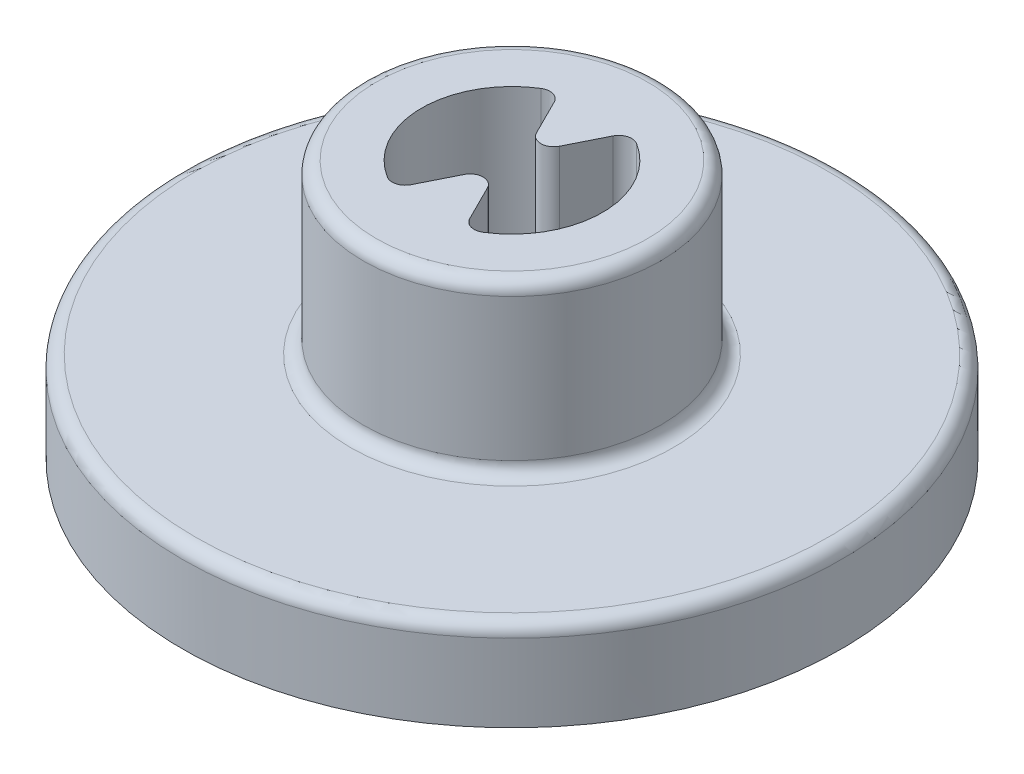
ISO-10303-21;
HEADER;
FILE_DESCRIPTION(('STEP AP214'),'2;1');
FILE_NAME('part.step','',(''),(''),'','','');
FILE_SCHEMA(('AUTOMOTIVE_DESIGN { 1 0 10303 214 1 1 1 1 }'));
ENDSEC;
DATA;
#1=APPLICATION_CONTEXT('core data for automotive mechanical design processes');
#2=APPLICATION_PROTOCOL_DEFINITION('international standard','automotive_design',2000,#1);
#3=PRODUCT_CONTEXT('',#1,'mechanical');
#4=PRODUCT('Part','Part','',(#3));
#5=PRODUCT_RELATED_PRODUCT_CATEGORY('part','',(#4));
#6=PRODUCT_DEFINITION_FORMATION('','',#4);
#7=PRODUCT_DEFINITION_CONTEXT('part definition',#1,'design');
#8=PRODUCT_DEFINITION('design','',#6,#7);
#9=PRODUCT_DEFINITION_SHAPE('','',#8);
#10=(LENGTH_UNIT() NAMED_UNIT(*) SI_UNIT(.MILLI.,.METRE.));
#11=(NAMED_UNIT(*) PLANE_ANGLE_UNIT() SI_UNIT($,.RADIAN.));
#12=(NAMED_UNIT(*) SI_UNIT($,.STERADIAN.) SOLID_ANGLE_UNIT());
#13=UNCERTAINTY_MEASURE_WITH_UNIT(LENGTH_MEASURE(1.E-05),#10,'distance_accuracy_value','');
#14=(GEOMETRIC_REPRESENTATION_CONTEXT(3) GLOBAL_UNCERTAINTY_ASSIGNED_CONTEXT((#13)) GLOBAL_UNIT_ASSIGNED_CONTEXT((#10,
#11,#12)) REPRESENTATION_CONTEXT('',''));
#15=CARTESIAN_POINT('',(0.,0.,0.));
#16=DIRECTION('',(0.,0.,1.));
#17=DIRECTION('',(1.,0.,0.));
#18=AXIS2_PLACEMENT_3D('',#15,#16,#17);
#19=CARTESIAN_POINT('',(0.,3.5,0.));
#20=DIRECTION('',(0.,-1.,0.));
#21=DIRECTION('',(0.,0.,-1.));
#22=AXIS2_PLACEMENT_3D('',#19,#20,#21);
#23=CYLINDRICAL_SURFACE('',#22,12.75);
#24=CARTESIAN_POINT('',(0.,3.,0.));
#25=DIRECTION('',(0.,1.,0.));
#26=DIRECTION('',(0.,0.,1.));
#27=AXIS2_PLACEMENT_3D('',#24,#25,#26);
#28=CIRCLE('',#27,12.75);
#29=CARTESIAN_POINT('',(0.,3.,-12.75));
#30=VERTEX_POINT('',#29);
#31=EDGE_CURVE('E234',#30,#30,#28,.F.);
#32=CARTESIAN_POINT('',(0.,0.,0.));
#33=DIRECTION('',(0.,1.,0.));
#34=DIRECTION('',(0.,0.,1.));
#35=AXIS2_PLACEMENT_3D('',#32,#33,#34);
#36=CIRCLE('',#35,12.75);
#37=CARTESIAN_POINT('',(0.,0.,-12.75));
#38=VERTEX_POINT('',#37);
#39=EDGE_CURVE('E206',#38,#38,#36,.T.);
#40=CARTESIAN_POINT('',(0.,3.,-12.75));
#41=CARTESIAN_POINT('',(0.,2.96875,-12.75));
#42=CARTESIAN_POINT('',(0.,2.9375,-12.75));
#43=CARTESIAN_POINT('',(0.,2.875,-12.75));
#44=CARTESIAN_POINT('',(0.,2.84375,-12.75));
#45=CARTESIAN_POINT('',(0.,2.78125,-12.75));
#46=CARTESIAN_POINT('',(0.,2.75,-12.75));
#47=CARTESIAN_POINT('',(0.,2.6875,-12.75));
#48=CARTESIAN_POINT('',(0.,2.65625,-12.75));
#49=CARTESIAN_POINT('',(0.,2.59375,-12.75));
#50=CARTESIAN_POINT('',(0.,2.5625,-12.75));
#51=CARTESIAN_POINT('',(0.,2.5,-12.75));
#52=CARTESIAN_POINT('',(0.,2.46875,-12.75));
#53=CARTESIAN_POINT('',(0.,2.40625,-12.75));
#54=CARTESIAN_POINT('',(0.,2.375,-12.75));
#55=CARTESIAN_POINT('',(0.,2.3125,-12.75));
#56=CARTESIAN_POINT('',(0.,2.28125,-12.75));
#57=CARTESIAN_POINT('',(0.,2.21875,-12.75));
#58=CARTESIAN_POINT('',(0.,2.1875,-12.75));
#59=CARTESIAN_POINT('',(0.,2.125,-12.75));
#60=CARTESIAN_POINT('',(0.,2.09375,-12.75));
#61=CARTESIAN_POINT('',(0.,2.03125,-12.75));
#62=CARTESIAN_POINT('',(0.,2.,-12.75));
#63=CARTESIAN_POINT('',(0.,1.9375,-12.75));
#64=CARTESIAN_POINT('',(0.,1.90625,-12.75));
#65=CARTESIAN_POINT('',(0.,1.84375,-12.75));
#66=CARTESIAN_POINT('',(0.,1.8125,-12.75));
#67=CARTESIAN_POINT('',(0.,1.75,-12.75));
#68=CARTESIAN_POINT('',(0.,1.71875,-12.75));
#69=CARTESIAN_POINT('',(0.,1.65625,-12.75));
#70=CARTESIAN_POINT('',(0.,1.625,-12.75));
#71=CARTESIAN_POINT('',(0.,1.5625,-12.75));
#72=CARTESIAN_POINT('',(0.,1.53125,-12.75));
#73=CARTESIAN_POINT('',(0.,1.46875,-12.75));
#74=CARTESIAN_POINT('',(0.,1.4375,-12.75));
#75=CARTESIAN_POINT('',(0.,1.375,-12.75));
#76=CARTESIAN_POINT('',(0.,1.34375,-12.75));
#77=CARTESIAN_POINT('',(0.,1.28125,-12.75));
#78=CARTESIAN_POINT('',(0.,1.25,-12.75));
#79=CARTESIAN_POINT('',(0.,1.1875,-12.75));
#80=CARTESIAN_POINT('',(0.,1.15625,-12.75));
#81=CARTESIAN_POINT('',(0.,1.09375,-12.75));
#82=CARTESIAN_POINT('',(0.,1.0625,-12.75));
#83=CARTESIAN_POINT('',(0.,1.,-12.75));
#84=CARTESIAN_POINT('',(0.,0.96875,-12.75));
#85=CARTESIAN_POINT('',(0.,0.90625,-12.75));
#86=CARTESIAN_POINT('',(0.,0.874999999999999,-12.75));
#87=CARTESIAN_POINT('',(0.,0.812499999999999,-12.75));
#88=CARTESIAN_POINT('',(0.,0.781249999999999,-12.75));
#89=CARTESIAN_POINT('',(0.,0.71875,-12.75));
#90=CARTESIAN_POINT('',(0.,0.6875,-12.75));
#91=CARTESIAN_POINT('',(0.,0.625,-12.75));
#92=CARTESIAN_POINT('',(0.,0.59375,-12.75));
#93=CARTESIAN_POINT('',(0.,0.53125,-12.75));
#94=CARTESIAN_POINT('',(0.,0.5,-12.75));
#95=CARTESIAN_POINT('',(0.,0.4375,-12.75));
#96=CARTESIAN_POINT('',(0.,0.40625,-12.75));
#97=CARTESIAN_POINT('',(0.,0.34375,-12.75));
#98=CARTESIAN_POINT('',(0.,0.3125,-12.75));
#99=CARTESIAN_POINT('',(0.,0.25,-12.75));
#100=CARTESIAN_POINT('',(0.,0.21875,-12.75));
#101=CARTESIAN_POINT('',(0.,0.15625,-12.75));
#102=CARTESIAN_POINT('',(0.,0.125,-12.75));
#103=CARTESIAN_POINT('',(0.,0.0624999999999996,-12.75));
#104=CARTESIAN_POINT('',(0.,0.0312499999999996,-12.75));
#105=CARTESIAN_POINT('',(0.,0.,-12.75));
#106=B_SPLINE_CURVE_WITH_KNOTS('',3,(#40,#41,#42,#43,#44,#45,#46,#47,#48,#49,#50,#51,#52,#53,
#54,#55,#56,#57,#58,#59,#60,#61,#62,#63,#64,#65,#66,#67,#68,#69,#70,#71,#72,#73,#74,#75,#76,#77,
#78,#79,#80,#81,#82,#83,#84,#85,#86,#87,#88,#89,#90,#91,#92,#93,#94,#95,#96,#97,#98,#99,#100,
#101,#102,#103,#104,#105),.UNSPECIFIED.,.F.,.F.,(4,2,2,2,2,2,2,2,2,2,2,2,2,2,2,2,2,2,2,2,2,2,2,
2,2,2,2,2,2,2,2,2,4),(0.,0.0937500000000001,0.1875,0.28125,0.375,0.46875,0.5625,0.65625,0.75,
0.84375,0.9375,1.03125,1.125,1.21875,1.3125,1.40625,1.5,1.59375,1.6875,1.78125,1.875,1.96875,
2.0625,2.15625,2.25,2.34375,2.4375,2.53125,2.625,2.71875,2.8125,2.90625,3.),.UNSPECIFIED.);
#107=EDGE_CURVE('BSEAM36',#30,#38,#106,.T.);
#108=ORIENTED_EDGE('',*,*,#31,.T.);
#109=ORIENTED_EDGE('',*,*,#39,.T.);
#110=ORIENTED_EDGE('',*,*,#107,.T.);
#111=ORIENTED_EDGE('',*,*,#107,.F.);
#112=EDGE_LOOP('',(#108,#110,#109,#111));
#113=FACE_BOUND('',#112,.T.);
#114=ADVANCED_FACE('F36',(#113),#23,.T.);
#115=CARTESIAN_POINT('',(0.,3.5,0.));
#116=DIRECTION('',(0.,1.,0.));
#117=DIRECTION('',(0.,0.,1.));
#118=AXIS2_PLACEMENT_3D('',#115,#116,#117);
#119=PLANE('',#118);
#120=CARTESIAN_POINT('',(0.,3.5,0.));
#121=DIRECTION('',(0.,1.,0.));
#122=DIRECTION('',(0.,0.,1.));
#123=AXIS2_PLACEMENT_3D('',#120,#121,#122);
#124=CIRCLE('',#123,12.25);
#125=CARTESIAN_POINT('',(0.,3.5,12.25));
#126=VERTEX_POINT('',#125);
#127=EDGE_CURVE('E231',#126,#126,#124,.T.);
#128=ORIENTED_EDGE('',*,*,#127,.T.);
#129=EDGE_LOOP('',(#128));
#130=FACE_BOUND('',#129,.T.);
#131=CARTESIAN_POINT('',(0.,3.5,0.));
#132=DIRECTION('',(0.,1.,0.));
#133=DIRECTION('',(0.,0.,1.));
#134=AXIS2_PLACEMENT_3D('',#131,#132,#133);
#135=CIRCLE('',#134,6.25);
#136=CARTESIAN_POINT('',(0.,3.5,6.25));
#137=VERTEX_POINT('',#136);
#138=EDGE_CURVE('E228',#137,#137,#135,.F.);
#139=ORIENTED_EDGE('',*,*,#138,.T.);
#140=EDGE_LOOP('',(#139));
#141=FACE_BOUND('',#140,.T.);
#142=ADVANCED_FACE('F255',(#130,#141),#119,.T.);
#143=CARTESIAN_POINT('',(0.,0.,0.));
#144=DIRECTION('',(0.,1.,0.));
#145=DIRECTION('',(0.,0.,1.));
#146=AXIS2_PLACEMENT_3D('',#143,#144,#145);
#147=PLANE('',#146);
#148=DIRECTION('',(-0.447213595499958,0.,0.894427190999916));
#149=VECTOR('',#148,1.);
#150=CARTESIAN_POINT('',(0.447213595499962,0.,-1.39442719099992));
#151=LINE('',#150,#149);
#152=CARTESIAN_POINT('',(1.13593463895132,0.,-2.77186927790264));
#153=VERTEX_POINT('',#152);
#154=CARTESIAN_POINT('',(0.447213595499962,0.,-1.39442719099992));
#155=VERTEX_POINT('',#154);
#156=EDGE_CURVE('E133',#153,#155,#151,.T.);
#157=ORIENTED_EDGE('',*,*,#156,.T.);
#158=CARTESIAN_POINT('',(0.,0.,-1.61803398874989));
#159=DIRECTION('',(0.,-1.,0.));
#160=DIRECTION('',(0.,0.,-1.));
#161=AXIS2_PLACEMENT_3D('',#158,#159,#160);
#162=CIRCLE('',#161,0.5);
#163=CARTESIAN_POINT('',(-0.447213595499962,0.,-1.39442719099992));
#164=VERTEX_POINT('',#163);
#165=EDGE_CURVE('E127',#155,#164,#162,.T.);
#166=ORIENTED_EDGE('',*,*,#165,.T.);
#167=DIRECTION('',(-0.447213595499958,0.,-0.894427190999916));
#168=VECTOR('',#167,1.);
#169=CARTESIAN_POINT('',(-0.447213595499962,0.,-1.39442719099992));
#170=LINE('',#169,#168);
#171=CARTESIAN_POINT('',(-1.13593463895132,0.,-2.77186927790264));
#172=VERTEX_POINT('',#171);
#173=EDGE_CURVE('E136',#164,#172,#170,.T.);
#174=ORIENTED_EDGE('',*,*,#173,.T.);
#175=CARTESIAN_POINT('',(-1.58314823445128,0.,-2.54826248015266));
#176=DIRECTION('',(0.,1.,0.));
#177=DIRECTION('',(0.,0.,1.));
#178=AXIS2_PLACEMENT_3D('',#175,#176,#177);
#179=CIRCLE('',#178,0.5);
#180=CARTESIAN_POINT('',(-1.84700627352649,0.,-2.97297289351144));
#181=VERTEX_POINT('',#180);
#182=EDGE_CURVE('E51',#172,#181,#179,.T.);
#183=ORIENTED_EDGE('',*,*,#182,.T.);
#184=CARTESIAN_POINT('',(0.,0.,0.));
#185=DIRECTION('',(0.,1.,0.));
#186=DIRECTION('',(0.,0.,1.));
#187=AXIS2_PLACEMENT_3D('',#184,#185,#186);
#188=CIRCLE('',#187,3.5);
#189=CARTESIAN_POINT('',(-1.84700627352649,0.,2.97297289351144));
#190=VERTEX_POINT('',#189);
#191=EDGE_CURVE('E151',#181,#190,#188,.T.);
#192=ORIENTED_EDGE('',*,*,#191,.T.);
#193=CARTESIAN_POINT('',(-1.58314823445128,0.,2.54826248015266));
#194=DIRECTION('',(0.,1.,0.));
#195=DIRECTION('',(0.,0.,-1.));
#196=AXIS2_PLACEMENT_3D('',#193,#194,#195);
#197=CIRCLE('',#196,0.5);
#198=CARTESIAN_POINT('',(-1.13593463895132,0.,2.77186927790264));
#199=VERTEX_POINT('',#198);
#200=EDGE_CURVE('E154',#190,#199,#197,.T.);
#201=ORIENTED_EDGE('',*,*,#200,.T.);
#202=DIRECTION('',(0.447213595499958,0.,-0.894427190999916));
#203=VECTOR('',#202,1.);
#204=CARTESIAN_POINT('',(-0.447213595499962,0.,1.39442719099992));
#205=LINE('',#204,#203);
#206=CARTESIAN_POINT('',(-0.447213595499961,0.,1.39442719099992));
#207=VERTEX_POINT('',#206);
#208=EDGE_CURVE('E157',#199,#207,#205,.T.);
#209=ORIENTED_EDGE('',*,*,#208,.T.);
#210=CARTESIAN_POINT('',(0.,0.,1.61803398874989));
#211=DIRECTION('',(0.,-1.,0.));
#212=DIRECTION('',(0.,0.,1.));
#213=AXIS2_PLACEMENT_3D('',#210,#211,#212);
#214=CIRCLE('',#213,0.5);
#215=CARTESIAN_POINT('',(0.447213595499962,0.,1.39442719099992));
#216=VERTEX_POINT('',#215);
#217=EDGE_CURVE('E160',#207,#216,#214,.T.);
#218=ORIENTED_EDGE('',*,*,#217,.T.);
#219=DIRECTION('',(0.447213595499958,0.,0.894427190999916));
#220=VECTOR('',#219,1.);
#221=CARTESIAN_POINT('',(0.447213595499962,0.,1.39442719099992));
#222=LINE('',#221,#220);
#223=CARTESIAN_POINT('',(1.13593463895132,0.,2.77186927790264));
#224=VERTEX_POINT('',#223);
#225=EDGE_CURVE('E163',#216,#224,#222,.T.);
#226=ORIENTED_EDGE('',*,*,#225,.T.);
#227=CARTESIAN_POINT('',(1.58314823445128,0.,2.54826248015266));
#228=DIRECTION('',(0.,1.,0.));
#229=DIRECTION('',(0.,0.,-1.));
#230=AXIS2_PLACEMENT_3D('',#227,#228,#229);
#231=CIRCLE('',#230,0.499999999999999);
#232=CARTESIAN_POINT('',(1.84700627352649,0.,2.97297289351144));
#233=VERTEX_POINT('',#232);
#234=EDGE_CURVE('E166',#224,#233,#231,.T.);
#235=ORIENTED_EDGE('',*,*,#234,.T.);
#236=CARTESIAN_POINT('',(0.,0.,0.));
#237=DIRECTION('',(0.,1.,0.));
#238=DIRECTION('',(0.,0.,1.));
#239=AXIS2_PLACEMENT_3D('',#236,#237,#238);
#240=CIRCLE('',#239,3.5);
#241=CARTESIAN_POINT('',(1.84700627352649,0.,-2.97297289351144));
#242=VERTEX_POINT('',#241);
#243=EDGE_CURVE('E169',#233,#242,#240,.T.);
#244=ORIENTED_EDGE('',*,*,#243,.T.);
#245=CARTESIAN_POINT('',(1.58314823445128,0.,-2.54826248015266));
#246=DIRECTION('',(0.,1.,0.));
#247=DIRECTION('',(0.,0.,1.));
#248=AXIS2_PLACEMENT_3D('',#245,#246,#247);
#249=CIRCLE('',#248,0.499999999999999);
#250=EDGE_CURVE('E172',#242,#153,#249,.T.);
#251=ORIENTED_EDGE('',*,*,#250,.T.);
#252=EDGE_LOOP('',(#157,#166,#174,#183,#192,#201,#209,#218,#226,#235,#244,#251));
#253=FACE_BOUND('',#252,.T.);
#254=ORIENTED_EDGE('',*,*,#39,.F.);
#255=EDGE_LOOP('',(#254));
#256=FACE_BOUND('',#255,.T.);
#257=ADVANCED_FACE('F140',(#253,#256),#147,.F.);
#258=CARTESIAN_POINT('',(0.,10.,0.));
#259=DIRECTION('',(0.,-1.,0.));
#260=DIRECTION('',(0.,0.,-1.));
#261=AXIS2_PLACEMENT_3D('',#258,#259,#260);
#262=CYLINDRICAL_SURFACE('',#261,5.75);
#263=CARTESIAN_POINT('',(0.,9.5,0.));
#264=DIRECTION('',(0.,1.,0.));
#265=DIRECTION('',(0.,0.,1.));
#266=AXIS2_PLACEMENT_3D('',#263,#264,#265);
#267=CIRCLE('',#266,5.75);
#268=CARTESIAN_POINT('',(0.,9.5,5.75));
#269=VERTEX_POINT('',#268);
#270=EDGE_CURVE('E11',#269,#269,#267,.F.);
#271=ORIENTED_EDGE('',*,*,#270,.T.);
#272=EDGE_LOOP('',(#271));
#273=FACE_BOUND('',#272,.T.);
#274=CARTESIAN_POINT('',(0.,4.,0.));
#275=DIRECTION('',(0.,1.,0.));
#276=DIRECTION('',(0.,0.,1.));
#277=AXIS2_PLACEMENT_3D('',#274,#275,#276);
#278=CIRCLE('',#277,5.75);
#279=CARTESIAN_POINT('',(0.,4.,5.75));
#280=VERTEX_POINT('',#279);
#281=EDGE_CURVE('E237',#280,#280,#278,.T.);
#282=ORIENTED_EDGE('',*,*,#281,.T.);
#283=EDGE_LOOP('',(#282));
#284=FACE_BOUND('',#283,.T.);
#285=ADVANCED_FACE('F281',(#273,#284),#262,.T.);
#286=CARTESIAN_POINT('',(0.,10.,0.));
#287=DIRECTION('',(0.,1.,0.));
#288=DIRECTION('',(0.,0.,1.));
#289=AXIS2_PLACEMENT_3D('',#286,#287,#288);
#290=PLANE('',#289);
#291=CARTESIAN_POINT('',(0.,10.,0.));
#292=DIRECTION('',(0.,1.,0.));
#293=DIRECTION('',(0.,0.,1.));
#294=AXIS2_PLACEMENT_3D('',#291,#292,#293);
#295=CIRCLE('',#294,5.25);
#296=CARTESIAN_POINT('',(0.,10.,5.25));
#297=VERTEX_POINT('',#296);
#298=EDGE_CURVE('E44',#297,#297,#295,.T.);
#299=ORIENTED_EDGE('',*,*,#298,.T.);
#300=EDGE_LOOP('',(#299));
#301=FACE_BOUND('',#300,.T.);
#302=CARTESIAN_POINT('',(0.,10.,-1.61803398874989));
#303=DIRECTION('',(0.,-1.,0.));
#304=DIRECTION('',(0.,0.,-1.));
#305=AXIS2_PLACEMENT_3D('',#302,#303,#304);
#306=CIRCLE('',#305,0.5);
#307=CARTESIAN_POINT('',(0.447213595499962,10.,-1.39442719099992));
#308=VERTEX_POINT('',#307);
#309=CARTESIAN_POINT('',(-0.447213595499962,10.,-1.39442719099992));
#310=VERTEX_POINT('',#309);
#311=EDGE_CURVE('E59',#308,#310,#306,.T.);
#312=ORIENTED_EDGE('',*,*,#311,.F.);
#313=DIRECTION('',(-0.447213595499958,0.,0.894427190999916));
#314=VECTOR('',#313,1.);
#315=CARTESIAN_POINT('',(0.447213595499962,10.,-1.39442719099992));
#316=LINE('',#315,#314);
#317=CARTESIAN_POINT('',(1.13593463895132,10.,-2.77186927790264));
#318=VERTEX_POINT('',#317);
#319=EDGE_CURVE('E144',#318,#308,#316,.T.);
#320=ORIENTED_EDGE('',*,*,#319,.F.);
#321=CARTESIAN_POINT('',(1.58314823445128,10.,-2.54826248015266));
#322=DIRECTION('',(0.,1.,0.));
#323=DIRECTION('',(0.,0.,1.));
#324=AXIS2_PLACEMENT_3D('',#321,#322,#323);
#325=CIRCLE('',#324,0.499999999999999);
#326=CARTESIAN_POINT('',(1.84700627352649,10.,-2.97297289351144));
#327=VERTEX_POINT('',#326);
#328=EDGE_CURVE('E147',#327,#318,#325,.T.);
#329=ORIENTED_EDGE('',*,*,#328,.F.);
#330=CARTESIAN_POINT('',(0.,10.,0.));
#331=DIRECTION('',(0.,1.,0.));
#332=DIRECTION('',(0.,0.,1.));
#333=AXIS2_PLACEMENT_3D('',#330,#331,#332);
#334=CIRCLE('',#333,3.5);
#335=CARTESIAN_POINT('',(1.84700627352649,10.,2.97297289351144));
#336=VERTEX_POINT('',#335);
#337=EDGE_CURVE('E199',#336,#327,#334,.T.);
#338=ORIENTED_EDGE('',*,*,#337,.F.);
#339=CARTESIAN_POINT('',(1.58314823445128,10.,2.54826248015266));
#340=DIRECTION('',(0.,1.,0.));
#341=DIRECTION('',(0.,0.,-1.));
#342=AXIS2_PLACEMENT_3D('',#339,#340,#341);
#343=CIRCLE('',#342,0.499999999999999);
#344=CARTESIAN_POINT('',(1.13593463895132,10.,2.77186927790264));
#345=VERTEX_POINT('',#344);
#346=EDGE_CURVE('E196',#345,#336,#343,.T.);
#347=ORIENTED_EDGE('',*,*,#346,.F.);
#348=DIRECTION('',(0.447213595499958,0.,0.894427190999916));
#349=VECTOR('',#348,1.);
#350=CARTESIAN_POINT('',(0.447213595499962,10.,1.39442719099992));
#351=LINE('',#350,#349);
#352=CARTESIAN_POINT('',(0.447213595499962,10.,1.39442719099992));
#353=VERTEX_POINT('',#352);
#354=EDGE_CURVE('E193',#353,#345,#351,.T.);
#355=ORIENTED_EDGE('',*,*,#354,.F.);
#356=CARTESIAN_POINT('',(0.,10.,1.61803398874989));
#357=DIRECTION('',(0.,-1.,0.));
#358=DIRECTION('',(0.,0.,1.));
#359=AXIS2_PLACEMENT_3D('',#356,#357,#358);
#360=CIRCLE('',#359,0.5);
#361=CARTESIAN_POINT('',(-0.447213595499961,10.,1.39442719099992));
#362=VERTEX_POINT('',#361);
#363=EDGE_CURVE('E190',#362,#353,#360,.T.);
#364=ORIENTED_EDGE('',*,*,#363,.F.);
#365=DIRECTION('',(0.447213595499958,0.,-0.894427190999916));
#366=VECTOR('',#365,1.);
#367=CARTESIAN_POINT('',(-0.447213595499962,10.,1.39442719099992));
#368=LINE('',#367,#366);
#369=CARTESIAN_POINT('',(-1.13593463895132,10.,2.77186927790264));
#370=VERTEX_POINT('',#369);
#371=EDGE_CURVE('E187',#370,#362,#368,.T.);
#372=ORIENTED_EDGE('',*,*,#371,.F.);
#373=CARTESIAN_POINT('',(-1.58314823445128,10.,2.54826248015266));
#374=DIRECTION('',(0.,1.,0.));
#375=DIRECTION('',(0.,0.,-1.));
#376=AXIS2_PLACEMENT_3D('',#373,#374,#375);
#377=CIRCLE('',#376,0.5);
#378=CARTESIAN_POINT('',(-1.84700627352649,10.,2.97297289351144));
#379=VERTEX_POINT('',#378);
#380=EDGE_CURVE('E184',#379,#370,#377,.T.);
#381=ORIENTED_EDGE('',*,*,#380,.F.);
#382=CARTESIAN_POINT('',(0.,10.,0.));
#383=DIRECTION('',(0.,1.,0.));
#384=DIRECTION('',(0.,0.,1.));
#385=AXIS2_PLACEMENT_3D('',#382,#383,#384);
#386=CIRCLE('',#385,3.5);
#387=CARTESIAN_POINT('',(-1.84700627352649,10.,-2.97297289351144));
#388=VERTEX_POINT('',#387);
#389=EDGE_CURVE('E181',#388,#379,#386,.T.);
#390=ORIENTED_EDGE('',*,*,#389,.F.);
#391=CARTESIAN_POINT('',(-1.58314823445128,10.,-2.54826248015266));
#392=DIRECTION('',(0.,1.,0.));
#393=DIRECTION('',(0.,0.,1.));
#394=AXIS2_PLACEMENT_3D('',#391,#392,#393);
#395=CIRCLE('',#394,0.5);
#396=CARTESIAN_POINT('',(-1.13593463895132,10.,-2.77186927790264));
#397=VERTEX_POINT('',#396);
#398=EDGE_CURVE('E178',#397,#388,#395,.T.);
#399=ORIENTED_EDGE('',*,*,#398,.F.);
#400=DIRECTION('',(-0.447213595499958,0.,-0.894427190999916));
#401=VECTOR('',#400,1.);
#402=CARTESIAN_POINT('',(-0.447213595499962,10.,-1.39442719099992));
#403=LINE('',#402,#401);
#404=EDGE_CURVE('E176',#310,#397,#403,.T.);
#405=ORIENTED_EDGE('',*,*,#404,.F.);
#406=EDGE_LOOP('',(#312,#320,#329,#338,#347,#355,#364,#372,#381,#390,#399,#405));
#407=FACE_BOUND('',#406,.T.);
#408=ADVANCED_FACE('F242',(#301,#407),#290,.T.);
#409=CARTESIAN_POINT('',(0.,0.,-1.61803398874989));
#410=DIRECTION('',(0.,1.,0.));
#411=DIRECTION('',(0.,0.,1.));
#412=AXIS2_PLACEMENT_3D('',#409,#410,#411);
#413=CYLINDRICAL_SURFACE('',#412,0.5);
#414=ORIENTED_EDGE('',*,*,#311,.T.);
#415=DIRECTION('',(0.,1.,0.));
#416=VECTOR('',#415,1.);
#417=CARTESIAN_POINT('',(-0.447213595499962,0.,-1.39442719099992));
#418=LINE('',#417,#416);
#419=EDGE_CURVE('E123',#164,#310,#418,.T.);
#420=ORIENTED_EDGE('',*,*,#419,.F.);
#421=ORIENTED_EDGE('',*,*,#165,.F.);
#422=DIRECTION('',(0.,1.,0.));
#423=VECTOR('',#422,1.);
#424=CARTESIAN_POINT('',(0.447213595499962,0.,-1.39442719099992));
#425=LINE('',#424,#423);
#426=EDGE_CURVE('E204',#155,#308,#425,.T.);
#427=ORIENTED_EDGE('',*,*,#426,.T.);
#428=EDGE_LOOP('',(#414,#420,#421,#427));
#429=FACE_BOUND('',#428,.T.);
#430=ADVANCED_FACE('F125',(#429),#413,.T.);
#431=CARTESIAN_POINT('',(0.447213595499962,0.,-1.39442719099992));
#432=DIRECTION('',(-0.894427190999916,0.,-0.447213595499958));
#433=DIRECTION('',(-0.447213595499958,0.,0.894427190999916));
#434=AXIS2_PLACEMENT_3D('',#431,#432,#433);
#435=PLANE('',#434);
#436=ORIENTED_EDGE('',*,*,#319,.T.);
#437=ORIENTED_EDGE('',*,*,#426,.F.);
#438=ORIENTED_EDGE('',*,*,#156,.F.);
#439=DIRECTION('',(0.,1.,0.));
#440=VECTOR('',#439,1.);
#441=CARTESIAN_POINT('',(1.13593463895132,0.,-2.77186927790264));
#442=LINE('',#441,#440);
#443=EDGE_CURVE('E207',#153,#318,#442,.T.);
#444=ORIENTED_EDGE('',*,*,#443,.T.);
#445=EDGE_LOOP('',(#436,#437,#438,#444));
#446=FACE_BOUND('',#445,.T.);
#447=ADVANCED_FACE('F292',(#446),#435,.F.);
#448=CARTESIAN_POINT('',(1.58314823445128,0.,-2.54826248015266));
#449=DIRECTION('',(0.,1.,0.));
#450=DIRECTION('',(0.,0.,1.));
#451=AXIS2_PLACEMENT_3D('',#448,#449,#450);
#452=CYLINDRICAL_SURFACE('',#451,0.499999999999999);
#453=ORIENTED_EDGE('',*,*,#328,.T.);
#454=ORIENTED_EDGE('',*,*,#443,.F.);
#455=ORIENTED_EDGE('',*,*,#250,.F.);
#456=DIRECTION('',(0.,1.,0.));
#457=VECTOR('',#456,1.);
#458=CARTESIAN_POINT('',(1.84700627352649,0.,-2.97297289351144));
#459=LINE('',#458,#457);
#460=EDGE_CURVE('E209',#242,#327,#459,.T.);
#461=ORIENTED_EDGE('',*,*,#460,.T.);
#462=EDGE_LOOP('',(#453,#454,#455,#461));
#463=FACE_BOUND('',#462,.T.);
#464=ADVANCED_FACE('F323',(#463),#452,.F.);
#465=CARTESIAN_POINT('',(0.,0.,0.));
#466=DIRECTION('',(0.,1.,0.));
#467=DIRECTION('',(0.,0.,1.));
#468=AXIS2_PLACEMENT_3D('',#465,#466,#467);
#469=CYLINDRICAL_SURFACE('',#468,3.5);
#470=ORIENTED_EDGE('',*,*,#337,.T.);
#471=ORIENTED_EDGE('',*,*,#460,.F.);
#472=ORIENTED_EDGE('',*,*,#243,.F.);
#473=DIRECTION('',(0.,1.,0.));
#474=VECTOR('',#473,1.);
#475=CARTESIAN_POINT('',(1.84700627352649,0.,2.97297289351144));
#476=LINE('',#475,#474);
#477=EDGE_CURVE('E211',#233,#336,#476,.T.);
#478=ORIENTED_EDGE('',*,*,#477,.T.);
#479=EDGE_LOOP('',(#470,#471,#472,#478));
#480=FACE_BOUND('',#479,.T.);
#481=ADVANCED_FACE('F319',(#480),#469,.F.);
#482=CARTESIAN_POINT('',(1.58314823445128,0.,2.54826248015266));
#483=DIRECTION('',(0.,1.,0.));
#484=DIRECTION('',(0.,0.,1.));
#485=AXIS2_PLACEMENT_3D('',#482,#483,#484);
#486=CYLINDRICAL_SURFACE('',#485,0.499999999999999);
#487=ORIENTED_EDGE('',*,*,#346,.T.);
#488=ORIENTED_EDGE('',*,*,#477,.F.);
#489=ORIENTED_EDGE('',*,*,#234,.F.);
#490=DIRECTION('',(0.,1.,0.));
#491=VECTOR('',#490,1.);
#492=CARTESIAN_POINT('',(1.13593463895132,0.,2.77186927790264));
#493=LINE('',#492,#491);
#494=EDGE_CURVE('E213',#224,#345,#493,.T.);
#495=ORIENTED_EDGE('',*,*,#494,.T.);
#496=EDGE_LOOP('',(#487,#488,#489,#495));
#497=FACE_BOUND('',#496,.T.);
#498=ADVANCED_FACE('F315',(#497),#486,.F.);
#499=CARTESIAN_POINT('',(0.447213595499962,0.,1.39442719099992));
#500=DIRECTION('',(-0.894427190999916,0.,0.447213595499958));
#501=DIRECTION('',(0.447213595499958,0.,0.894427190999916));
#502=AXIS2_PLACEMENT_3D('',#499,#500,#501);
#503=PLANE('',#502);
#504=ORIENTED_EDGE('',*,*,#354,.T.);
#505=ORIENTED_EDGE('',*,*,#494,.F.);
#506=ORIENTED_EDGE('',*,*,#225,.F.);
#507=DIRECTION('',(0.,1.,0.));
#508=VECTOR('',#507,1.);
#509=CARTESIAN_POINT('',(0.447213595499962,0.,1.39442719099992));
#510=LINE('',#509,#508);
#511=EDGE_CURVE('E215',#216,#353,#510,.T.);
#512=ORIENTED_EDGE('',*,*,#511,.T.);
#513=EDGE_LOOP('',(#504,#505,#506,#512));
#514=FACE_BOUND('',#513,.T.);
#515=ADVANCED_FACE('F311',(#514),#503,.F.);
#516=CARTESIAN_POINT('',(0.,0.,1.61803398874989));
#517=DIRECTION('',(0.,1.,0.));
#518=DIRECTION('',(0.,0.,1.));
#519=AXIS2_PLACEMENT_3D('',#516,#517,#518);
#520=CYLINDRICAL_SURFACE('',#519,0.5);
#521=ORIENTED_EDGE('',*,*,#363,.T.);
#522=ORIENTED_EDGE('',*,*,#511,.F.);
#523=ORIENTED_EDGE('',*,*,#217,.F.);
#524=DIRECTION('',(0.,1.,0.));
#525=VECTOR('',#524,1.);
#526=CARTESIAN_POINT('',(-0.447213595499961,0.,1.39442719099992));
#527=LINE('',#526,#525);
#528=EDGE_CURVE('E217',#207,#362,#527,.T.);
#529=ORIENTED_EDGE('',*,*,#528,.T.);
#530=EDGE_LOOP('',(#521,#522,#523,#529));
#531=FACE_BOUND('',#530,.T.);
#532=ADVANCED_FACE('F307',(#531),#520,.T.);
#533=CARTESIAN_POINT('',(-0.447213595499962,0.,1.39442719099992));
#534=DIRECTION('',(0.894427190999916,0.,0.447213595499958));
#535=DIRECTION('',(0.447213595499958,0.,-0.894427190999916));
#536=AXIS2_PLACEMENT_3D('',#533,#534,#535);
#537=PLANE('',#536);
#538=ORIENTED_EDGE('',*,*,#371,.T.);
#539=ORIENTED_EDGE('',*,*,#528,.F.);
#540=ORIENTED_EDGE('',*,*,#208,.F.);
#541=DIRECTION('',(0.,1.,0.));
#542=VECTOR('',#541,1.);
#543=CARTESIAN_POINT('',(-1.13593463895132,0.,2.77186927790264));
#544=LINE('',#543,#542);
#545=EDGE_CURVE('E219',#199,#370,#544,.T.);
#546=ORIENTED_EDGE('',*,*,#545,.T.);
#547=EDGE_LOOP('',(#538,#539,#540,#546));
#548=FACE_BOUND('',#547,.T.);
#549=ADVANCED_FACE('F303',(#548),#537,.F.);
#550=CARTESIAN_POINT('',(-1.58314823445128,0.,2.54826248015266));
#551=DIRECTION('',(0.,1.,0.));
#552=DIRECTION('',(0.,0.,1.));
#553=AXIS2_PLACEMENT_3D('',#550,#551,#552);
#554=CYLINDRICAL_SURFACE('',#553,0.5);
#555=ORIENTED_EDGE('',*,*,#380,.T.);
#556=ORIENTED_EDGE('',*,*,#545,.F.);
#557=ORIENTED_EDGE('',*,*,#200,.F.);
#558=DIRECTION('',(0.,1.,0.));
#559=VECTOR('',#558,1.);
#560=CARTESIAN_POINT('',(-1.84700627352649,0.,2.97297289351144));
#561=LINE('',#560,#559);
#562=EDGE_CURVE('E221',#190,#379,#561,.T.);
#563=ORIENTED_EDGE('',*,*,#562,.T.);
#564=EDGE_LOOP('',(#555,#556,#557,#563));
#565=FACE_BOUND('',#564,.T.);
#566=ADVANCED_FACE('F299',(#565),#554,.F.);
#567=CARTESIAN_POINT('',(0.,0.,0.));
#568=DIRECTION('',(0.,1.,0.));
#569=DIRECTION('',(0.,0.,1.));
#570=AXIS2_PLACEMENT_3D('',#567,#568,#569);
#571=CYLINDRICAL_SURFACE('',#570,3.5);
#572=ORIENTED_EDGE('',*,*,#389,.T.);
#573=ORIENTED_EDGE('',*,*,#562,.F.);
#574=ORIENTED_EDGE('',*,*,#191,.F.);
#575=DIRECTION('',(0.,1.,0.));
#576=VECTOR('',#575,1.);
#577=CARTESIAN_POINT('',(-1.84700627352649,0.,-2.97297289351144));
#578=LINE('',#577,#576);
#579=EDGE_CURVE('E223',#181,#388,#578,.T.);
#580=ORIENTED_EDGE('',*,*,#579,.T.);
#581=EDGE_LOOP('',(#572,#573,#574,#580));
#582=FACE_BOUND('',#581,.T.);
#583=ADVANCED_FACE('F296',(#582),#571,.F.);
#584=CARTESIAN_POINT('',(-1.58314823445128,0.,-2.54826248015266));
#585=DIRECTION('',(0.,1.,0.));
#586=DIRECTION('',(0.,0.,1.));
#587=AXIS2_PLACEMENT_3D('',#584,#585,#586);
#588=CYLINDRICAL_SURFACE('',#587,0.5);
#589=ORIENTED_EDGE('',*,*,#398,.T.);
#590=ORIENTED_EDGE('',*,*,#579,.F.);
#591=ORIENTED_EDGE('',*,*,#182,.F.);
#592=DIRECTION('',(0.,1.,0.));
#593=VECTOR('',#592,1.);
#594=CARTESIAN_POINT('',(-1.13593463895132,0.,-2.77186927790264));
#595=LINE('',#594,#593);
#596=EDGE_CURVE('E132',#172,#397,#595,.T.);
#597=ORIENTED_EDGE('',*,*,#596,.T.);
#598=EDGE_LOOP('',(#589,#590,#591,#597));
#599=FACE_BOUND('',#598,.T.);
#600=ADVANCED_FACE('F271',(#599),#588,.F.);
#601=CARTESIAN_POINT('',(-0.447213595499962,0.,-1.39442719099992));
#602=DIRECTION('',(0.894427190999916,0.,-0.447213595499958));
#603=DIRECTION('',(-0.447213595499958,0.,-0.894427190999916));
#604=AXIS2_PLACEMENT_3D('',#601,#602,#603);
#605=PLANE('',#604);
#606=ORIENTED_EDGE('',*,*,#404,.T.);
#607=ORIENTED_EDGE('',*,*,#596,.F.);
#608=ORIENTED_EDGE('',*,*,#173,.F.);
#609=ORIENTED_EDGE('',*,*,#419,.T.);
#610=EDGE_LOOP('',(#606,#607,#608,#609));
#611=FACE_BOUND('',#610,.T.);
#612=ADVANCED_FACE('F137',(#611),#605,.F.);
#613=CARTESIAN_POINT('',(0.,3.,0.));
#614=DIRECTION('',(0.,1.,0.));
#615=DIRECTION('',(0.,0.,1.));
#616=AXIS2_PLACEMENT_3D('',#613,#614,#615);
#617=TOROIDAL_SURFACE('',#616,12.25,0.5);
#618=ORIENTED_EDGE('',*,*,#31,.F.);
#619=EDGE_LOOP('',(#618));
#620=FACE_BOUND('',#619,.T.);
#621=ORIENTED_EDGE('',*,*,#127,.F.);
#622=EDGE_LOOP('',(#621));
#623=FACE_BOUND('',#622,.T.);
#624=ADVANCED_FACE('F251',(#620,#623),#617,.T.);
#625=CARTESIAN_POINT('',(0.,4.,0.));
#626=DIRECTION('',(0.,1.,0.));
#627=DIRECTION('',(0.,0.,1.));
#628=AXIS2_PLACEMENT_3D('',#625,#626,#627);
#629=TOROIDAL_SURFACE('',#628,6.25,0.5);
#630=ORIENTED_EDGE('',*,*,#138,.F.);
#631=EDGE_LOOP('',(#630));
#632=FACE_BOUND('',#631,.T.);
#633=ORIENTED_EDGE('',*,*,#281,.F.);
#634=EDGE_LOOP('',(#633));
#635=FACE_BOUND('',#634,.T.);
#636=ADVANCED_FACE('F246',(#632,#635),#629,.F.);
#637=CARTESIAN_POINT('',(0.,9.5,0.));
#638=DIRECTION('',(0.,1.,0.));
#639=DIRECTION('',(0.,0.,1.));
#640=AXIS2_PLACEMENT_3D('',#637,#638,#639);
#641=TOROIDAL_SURFACE('',#640,5.25,0.5);
#642=ORIENTED_EDGE('',*,*,#270,.F.);
#643=EDGE_LOOP('',(#642));
#644=FACE_BOUND('',#643,.T.);
#645=ORIENTED_EDGE('',*,*,#298,.F.);
#646=EDGE_LOOP('',(#645));
#647=FACE_BOUND('',#646,.T.);
#648=ADVANCED_FACE('F38',(#644,#647),#641,.T.);
#649=CLOSED_SHELL('',(#114,#142,#257,#285,#408,#430,#447,#464,#481,#498,#515,#532,#549,#566,
#583,#600,#612,#624,#636,#648));
#650=MANIFOLD_SOLID_BREP('B2',#649);
#651=ADVANCED_BREP_SHAPE_REPRESENTATION('',(#18,#650),#14);
#652=SHAPE_DEFINITION_REPRESENTATION(#9,#651);
ENDSEC;
END-ISO-10303-21;
